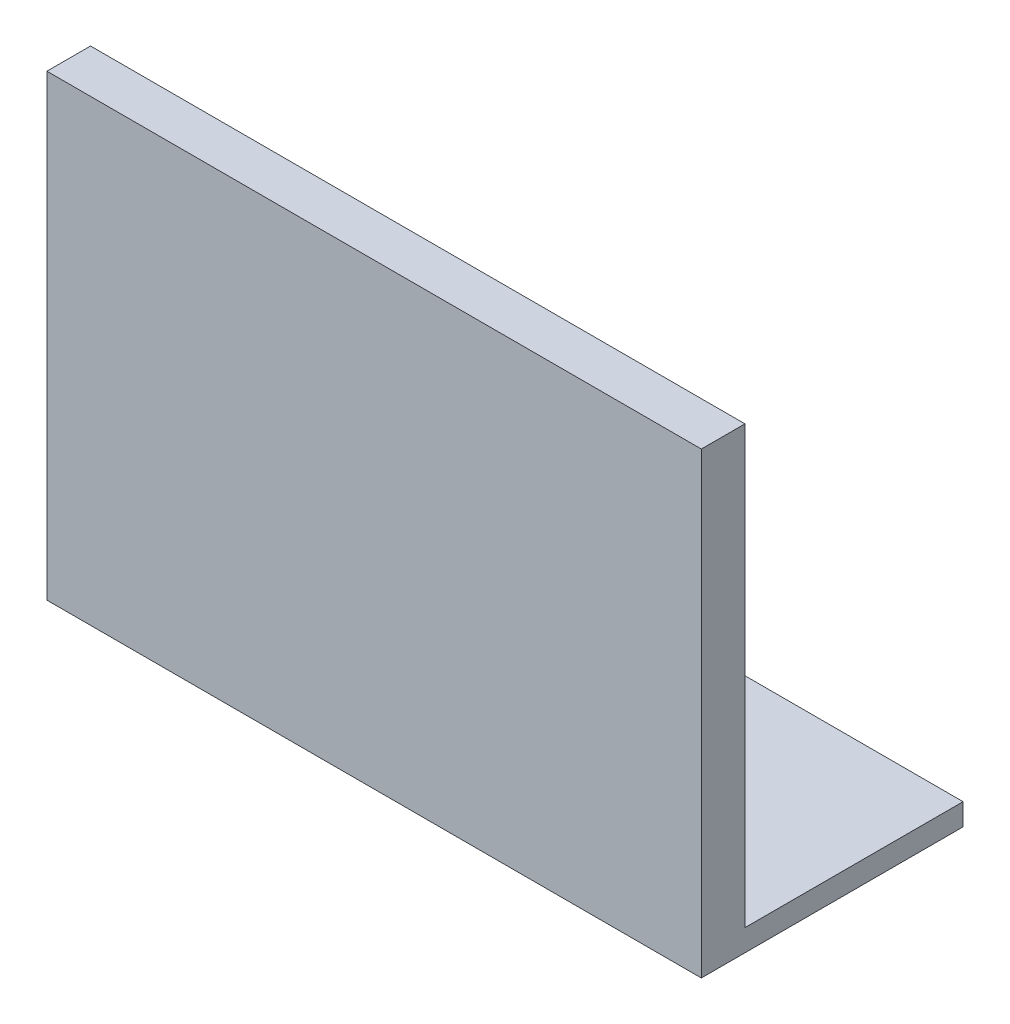
ISO-10303-21;
HEADER;
FILE_DESCRIPTION(('STEP AP214'),'2;1');
FILE_NAME('part.step','',(''),(''),'','','');
FILE_SCHEMA(('AUTOMOTIVE_DESIGN { 1 0 10303 214 1 1 1 1 }'));
ENDSEC;
DATA;
#1=APPLICATION_CONTEXT('core data for automotive mechanical design processes');
#2=APPLICATION_PROTOCOL_DEFINITION('international standard','automotive_design',2000,#1);
#3=PRODUCT_CONTEXT('',#1,'mechanical');
#4=PRODUCT('Part','Part','',(#3));
#5=PRODUCT_RELATED_PRODUCT_CATEGORY('part','',(#4));
#6=PRODUCT_DEFINITION_FORMATION('','',#4);
#7=PRODUCT_DEFINITION_CONTEXT('part definition',#1,'design');
#8=PRODUCT_DEFINITION('design','',#6,#7);
#9=PRODUCT_DEFINITION_SHAPE('','',#8);
#10=(LENGTH_UNIT() NAMED_UNIT(*) SI_UNIT(.MILLI.,.METRE.));
#11=(NAMED_UNIT(*) PLANE_ANGLE_UNIT() SI_UNIT($,.RADIAN.));
#12=(NAMED_UNIT(*) SI_UNIT($,.STERADIAN.) SOLID_ANGLE_UNIT());
#13=UNCERTAINTY_MEASURE_WITH_UNIT(LENGTH_MEASURE(1.E-05),#10,'distance_accuracy_value','');
#14=(GEOMETRIC_REPRESENTATION_CONTEXT(3) GLOBAL_UNCERTAINTY_ASSIGNED_CONTEXT((#13)) GLOBAL_UNIT_ASSIGNED_CONTEXT((#10,
#11,#12)) REPRESENTATION_CONTEXT('',''));
#15=CARTESIAN_POINT('',(0.,0.,0.));
#16=DIRECTION('',(0.,0.,1.));
#17=DIRECTION('',(1.,0.,0.));
#18=AXIS2_PLACEMENT_3D('',#15,#16,#17);
#19=CARTESIAN_POINT('',(25.,0.,-15.));
#20=DIRECTION('',(0.,1.,0.));
#21=DIRECTION('',(0.,0.,1.));
#22=AXIS2_PLACEMENT_3D('',#19,#20,#21);
#23=CYLINDRICAL_SURFACE('',#22,3.5);
#24=CARTESIAN_POINT('',(25.,0.,-15.));
#25=DIRECTION('',(0.,1.,0.));
#26=DIRECTION('',(0.,0.,1.));
#27=AXIS2_PLACEMENT_3D('',#24,#25,#26);
#28=CIRCLE('',#27,3.5);
#29=CARTESIAN_POINT('',(25.,0.,-11.5));
#30=VERTEX_POINT('',#29);
#31=EDGE_CURVE('E132',#30,#30,#28,.T.);
#32=ORIENTED_EDGE('',*,*,#31,.F.);
#33=EDGE_LOOP('',(#32));
#34=FACE_BOUND('',#33,.T.);
#35=CARTESIAN_POINT('',(25.,4.,-15.));
#36=DIRECTION('',(0.,1.,0.));
#37=DIRECTION('',(0.,0.,1.));
#38=AXIS2_PLACEMENT_3D('',#35,#36,#37);
#39=CIRCLE('',#38,3.5);
#40=CARTESIAN_POINT('',(25.,4.,-11.5));
#41=VERTEX_POINT('',#40);
#42=EDGE_CURVE('E43',#41,#41,#39,.F.);
#43=ORIENTED_EDGE('',*,*,#42,.F.);
#44=EDGE_LOOP('',(#43));
#45=FACE_BOUND('',#44,.T.);
#46=ADVANCED_FACE('F39',(#34,#45),#23,.F.);
#47=CARTESIAN_POINT('',(-25.,0.,-15.));
#48=DIRECTION('',(0.,1.,0.));
#49=DIRECTION('',(0.,0.,1.));
#50=AXIS2_PLACEMENT_3D('',#47,#48,#49);
#51=CYLINDRICAL_SURFACE('',#50,3.5);
#52=CARTESIAN_POINT('',(-25.,0.,-15.));
#53=DIRECTION('',(0.,1.,0.));
#54=DIRECTION('',(0.,0.,1.));
#55=AXIS2_PLACEMENT_3D('',#52,#53,#54);
#56=CIRCLE('',#55,3.5);
#57=CARTESIAN_POINT('',(-25.,0.,-11.5));
#58=VERTEX_POINT('',#57);
#59=EDGE_CURVE('E150',#58,#58,#56,.T.);
#60=ORIENTED_EDGE('',*,*,#59,.F.);
#61=EDGE_LOOP('',(#60));
#62=FACE_BOUND('',#61,.T.);
#63=CARTESIAN_POINT('',(-25.,4.,-15.));
#64=DIRECTION('',(0.,1.,0.));
#65=DIRECTION('',(0.,0.,1.));
#66=AXIS2_PLACEMENT_3D('',#63,#64,#65);
#67=CIRCLE('',#66,3.5);
#68=CARTESIAN_POINT('',(-25.,4.,-11.5));
#69=VERTEX_POINT('',#68);
#70=EDGE_CURVE('E123',#69,#69,#67,.F.);
#71=ORIENTED_EDGE('',*,*,#70,.F.);
#72=EDGE_LOOP('',(#71));
#73=FACE_BOUND('',#72,.T.);
#74=ADVANCED_FACE('F217',(#62,#73),#51,.F.);
#75=CARTESIAN_POINT('',(0.,5.,0.));
#76=DIRECTION('',(0.,-1.,0.));
#77=DIRECTION('',(0.,0.,-1.));
#78=AXIS2_PLACEMENT_3D('',#75,#76,#77);
#79=PLANE('',#78);
#80=CARTESIAN_POINT('',(-25.,5.,-15.));
#81=DIRECTION('',(0.,1.,0.));
#82=DIRECTION('',(0.,0.,1.));
#83=AXIS2_PLACEMENT_3D('',#80,#81,#82);
#84=CIRCLE('',#83,5.);
#85=CARTESIAN_POINT('',(-25.,5.,-9.99999999999999));
#86=VERTEX_POINT('',#85);
#87=EDGE_CURVE('E134',#86,#86,#84,.T.);
#88=ORIENTED_EDGE('',*,*,#87,.F.);
#89=EDGE_LOOP('',(#88));
#90=FACE_BOUND('',#89,.T.);
#91=CARTESIAN_POINT('',(25.,5.,-15.));
#92=DIRECTION('',(0.,1.,0.));
#93=DIRECTION('',(0.,0.,1.));
#94=AXIS2_PLACEMENT_3D('',#91,#92,#93);
#95=CIRCLE('',#94,5.);
#96=CARTESIAN_POINT('',(25.,5.,-10.));
#97=VERTEX_POINT('',#96);
#98=EDGE_CURVE('E146',#97,#97,#95,.T.);
#99=ORIENTED_EDGE('',*,*,#98,.F.);
#100=EDGE_LOOP('',(#99));
#101=FACE_BOUND('',#100,.T.);
#102=DIRECTION('',(-1.,0.,0.));
#103=VECTOR('',#102,1.);
#104=CARTESIAN_POINT('',(-75.,5.,20.));
#105=LINE('',#104,#103);
#106=CARTESIAN_POINT('',(75.,5.,20.));
#107=VERTEX_POINT('',#106);
#108=CARTESIAN_POINT('',(-75.,5.,20.));
#109=VERTEX_POINT('',#108);
#110=EDGE_CURVE('E57',#107,#109,#105,.T.);
#111=ORIENTED_EDGE('',*,*,#110,.F.);
#112=DIRECTION('',(0.,0.,-1.));
#113=VECTOR('',#112,1.);
#114=CARTESIAN_POINT('',(75.,5.,-30.));
#115=LINE('',#114,#113);
#116=CARTESIAN_POINT('',(75.,5.,-30.));
#117=VERTEX_POINT('',#116);
#118=EDGE_CURVE('E178',#107,#117,#115,.T.);
#119=ORIENTED_EDGE('',*,*,#118,.T.);
#120=DIRECTION('',(-1.,0.,0.));
#121=VECTOR('',#120,1.);
#122=CARTESIAN_POINT('',(75.,5.,-30.));
#123=LINE('',#122,#121);
#124=CARTESIAN_POINT('',(-75.,5.,-30.));
#125=VERTEX_POINT('',#124);
#126=EDGE_CURVE('E63',#117,#125,#123,.T.);
#127=ORIENTED_EDGE('',*,*,#126,.T.);
#128=DIRECTION('',(0.,0.,1.));
#129=VECTOR('',#128,1.);
#130=CARTESIAN_POINT('',(-75.,5.,-30.));
#131=LINE('',#130,#129);
#132=EDGE_CURVE('E93',#125,#109,#131,.T.);
#133=ORIENTED_EDGE('',*,*,#132,.T.);
#134=EDGE_LOOP('',(#111,#119,#127,#133));
#135=FACE_BOUND('',#134,.T.);
#136=ADVANCED_FACE('F181',(#90,#101,#135),#79,.F.);
#137=CARTESIAN_POINT('',(-75.,5.,-30.));
#138=DIRECTION('',(1.,0.,0.));
#139=DIRECTION('',(0.,0.,-1.));
#140=AXIS2_PLACEMENT_3D('',#137,#138,#139);
#141=PLANE('',#140);
#142=DIRECTION('',(0.,0.,1.));
#143=VECTOR('',#142,1.);
#144=CARTESIAN_POINT('',(-75.,0.,-30.));
#145=LINE('',#144,#143);
#146=CARTESIAN_POINT('',(-75.,0.,-30.));
#147=VERTEX_POINT('',#146);
#148=CARTESIAN_POINT('',(-75.,0.,30.));
#149=VERTEX_POINT('',#148);
#150=EDGE_CURVE('E99',#147,#149,#145,.T.);
#151=ORIENTED_EDGE('',*,*,#150,.T.);
#152=DIRECTION('',(0.,-1.,0.));
#153=VECTOR('',#152,1.);
#154=CARTESIAN_POINT('',(-75.,5.,30.));
#155=LINE('',#154,#153);
#156=CARTESIAN_POINT('',(-75.,105.,30.));
#157=VERTEX_POINT('',#156);
#158=EDGE_CURVE('E11',#157,#149,#155,.T.);
#159=ORIENTED_EDGE('',*,*,#158,.F.);
#160=DIRECTION('',(0.,0.,1.));
#161=VECTOR('',#160,1.);
#162=CARTESIAN_POINT('',(-75.,105.,30.));
#163=LINE('',#162,#161);
#164=CARTESIAN_POINT('',(-75.,105.,20.));
#165=VERTEX_POINT('',#164);
#166=EDGE_CURVE('E157',#165,#157,#163,.T.);
#167=ORIENTED_EDGE('',*,*,#166,.F.);
#168=DIRECTION('',(0.,-1.,0.));
#169=VECTOR('',#168,1.);
#170=CARTESIAN_POINT('',(-75.,105.,20.));
#171=LINE('',#170,#169);
#172=EDGE_CURVE('E112',#165,#109,#171,.T.);
#173=ORIENTED_EDGE('',*,*,#172,.T.);
#174=ORIENTED_EDGE('',*,*,#132,.F.);
#175=DIRECTION('',(0.,-1.,0.));
#176=VECTOR('',#175,1.);
#177=CARTESIAN_POINT('',(-75.,5.,-30.));
#178=LINE('',#177,#176);
#179=EDGE_CURVE('E85',#125,#147,#178,.T.);
#180=ORIENTED_EDGE('',*,*,#179,.T.);
#181=EDGE_LOOP('',(#151,#159,#167,#173,#174,#180));
#182=FACE_BOUND('',#181,.T.);
#183=ADVANCED_FACE('F41',(#182),#141,.F.);
#184=CARTESIAN_POINT('',(75.,5.,30.));
#185=DIRECTION('',(0.,0.,-1.));
#186=DIRECTION('',(-1.,0.,0.));
#187=AXIS2_PLACEMENT_3D('',#184,#185,#186);
#188=PLANE('',#187);
#189=DIRECTION('',(1.,0.,0.));
#190=VECTOR('',#189,1.);
#191=CARTESIAN_POINT('',(75.,0.,30.));
#192=LINE('',#191,#190);
#193=CARTESIAN_POINT('',(75.,0.,30.));
#194=VERTEX_POINT('',#193);
#195=EDGE_CURVE('E104',#149,#194,#192,.T.);
#196=ORIENTED_EDGE('',*,*,#195,.T.);
#197=DIRECTION('',(0.,-1.,0.));
#198=VECTOR('',#197,1.);
#199=CARTESIAN_POINT('',(75.,5.,30.));
#200=LINE('',#199,#198);
#201=CARTESIAN_POINT('',(75.,105.,30.));
#202=VERTEX_POINT('',#201);
#203=EDGE_CURVE('E49',#202,#194,#200,.T.);
#204=ORIENTED_EDGE('',*,*,#203,.F.);
#205=DIRECTION('',(1.,0.,0.));
#206=VECTOR('',#205,1.);
#207=CARTESIAN_POINT('',(-75.,105.,30.));
#208=LINE('',#207,#206);
#209=EDGE_CURVE('E161',#157,#202,#208,.T.);
#210=ORIENTED_EDGE('',*,*,#209,.F.);
#211=ORIENTED_EDGE('',*,*,#158,.T.);
#212=EDGE_LOOP('',(#196,#204,#210,#211));
#213=FACE_BOUND('',#212,.T.);
#214=ADVANCED_FACE('F190',(#213),#188,.F.);
#215=CARTESIAN_POINT('',(75.,5.,-30.));
#216=DIRECTION('',(-1.,0.,0.));
#217=DIRECTION('',(0.,0.,1.));
#218=AXIS2_PLACEMENT_3D('',#215,#216,#217);
#219=PLANE('',#218);
#220=DIRECTION('',(0.,0.,-1.));
#221=VECTOR('',#220,1.);
#222=CARTESIAN_POINT('',(75.,0.,-30.));
#223=LINE('',#222,#221);
#224=CARTESIAN_POINT('',(75.,0.,-30.));
#225=VERTEX_POINT('',#224);
#226=EDGE_CURVE('E94',#194,#225,#223,.T.);
#227=ORIENTED_EDGE('',*,*,#226,.T.);
#228=DIRECTION('',(0.,-1.,0.));
#229=VECTOR('',#228,1.);
#230=CARTESIAN_POINT('',(75.,5.,-30.));
#231=LINE('',#230,#229);
#232=EDGE_CURVE('E88',#117,#225,#231,.T.);
#233=ORIENTED_EDGE('',*,*,#232,.F.);
#234=ORIENTED_EDGE('',*,*,#118,.F.);
#235=DIRECTION('',(0.,-1.,0.));
#236=VECTOR('',#235,1.);
#237=CARTESIAN_POINT('',(75.,105.,20.));
#238=LINE('',#237,#236);
#239=CARTESIAN_POINT('',(75.,105.,20.));
#240=VERTEX_POINT('',#239);
#241=EDGE_CURVE('E106',#240,#107,#238,.T.);
#242=ORIENTED_EDGE('',*,*,#241,.F.);
#243=DIRECTION('',(0.,0.,-1.));
#244=VECTOR('',#243,1.);
#245=CARTESIAN_POINT('',(75.,105.,30.));
#246=LINE('',#245,#244);
#247=EDGE_CURVE('E165',#202,#240,#246,.T.);
#248=ORIENTED_EDGE('',*,*,#247,.F.);
#249=ORIENTED_EDGE('',*,*,#203,.T.);
#250=EDGE_LOOP('',(#227,#233,#234,#242,#248,#249));
#251=FACE_BOUND('',#250,.T.);
#252=ADVANCED_FACE('F184',(#251),#219,.F.);
#253=CARTESIAN_POINT('',(75.,5.,-30.));
#254=DIRECTION('',(0.,0.,1.));
#255=DIRECTION('',(1.,0.,0.));
#256=AXIS2_PLACEMENT_3D('',#253,#254,#255);
#257=PLANE('',#256);
#258=DIRECTION('',(-1.,0.,0.));
#259=VECTOR('',#258,1.);
#260=CARTESIAN_POINT('',(75.,0.,-30.));
#261=LINE('',#260,#259);
#262=EDGE_CURVE('E82',#225,#147,#261,.T.);
#263=ORIENTED_EDGE('',*,*,#262,.T.);
#264=ORIENTED_EDGE('',*,*,#179,.F.);
#265=ORIENTED_EDGE('',*,*,#126,.F.);
#266=ORIENTED_EDGE('',*,*,#232,.T.);
#267=EDGE_LOOP('',(#263,#264,#265,#266));
#268=FACE_BOUND('',#267,.T.);
#269=ADVANCED_FACE('F84',(#268),#257,.F.);
#270=CARTESIAN_POINT('',(0.,0.,0.));
#271=DIRECTION('',(0.,-1.,0.));
#272=DIRECTION('',(0.,0.,-1.));
#273=AXIS2_PLACEMENT_3D('',#270,#271,#272);
#274=PLANE('',#273);
#275=ORIENTED_EDGE('',*,*,#59,.T.);
#276=EDGE_LOOP('',(#275));
#277=FACE_BOUND('',#276,.T.);
#278=ORIENTED_EDGE('',*,*,#31,.T.);
#279=EDGE_LOOP('',(#278));
#280=FACE_BOUND('',#279,.T.);
#281=ORIENTED_EDGE('',*,*,#150,.F.);
#282=ORIENTED_EDGE('',*,*,#262,.F.);
#283=ORIENTED_EDGE('',*,*,#226,.F.);
#284=ORIENTED_EDGE('',*,*,#195,.F.);
#285=EDGE_LOOP('',(#281,#282,#283,#284));
#286=FACE_BOUND('',#285,.T.);
#287=ADVANCED_FACE('F103',(#277,#280,#286),#274,.T.);
#288=CARTESIAN_POINT('',(-75.,105.,20.));
#289=DIRECTION('',(0.,0.,1.));
#290=DIRECTION('',(1.,0.,0.));
#291=AXIS2_PLACEMENT_3D('',#288,#289,#290);
#292=PLANE('',#291);
#293=ORIENTED_EDGE('',*,*,#110,.T.);
#294=ORIENTED_EDGE('',*,*,#172,.F.);
#295=DIRECTION('',(-1.,0.,0.));
#296=VECTOR('',#295,1.);
#297=CARTESIAN_POINT('',(-75.,105.,20.));
#298=LINE('',#297,#296);
#299=EDGE_CURVE('E169',#240,#165,#298,.T.);
#300=ORIENTED_EDGE('',*,*,#299,.F.);
#301=ORIENTED_EDGE('',*,*,#241,.T.);
#302=EDGE_LOOP('',(#293,#294,#300,#301));
#303=FACE_BOUND('',#302,.T.);
#304=ADVANCED_FACE('F204',(#303),#292,.F.);
#305=CARTESIAN_POINT('',(0.,105.,0.));
#306=DIRECTION('',(0.,-1.,0.));
#307=DIRECTION('',(0.,0.,-1.));
#308=AXIS2_PLACEMENT_3D('',#305,#306,#307);
#309=PLANE('',#308);
#310=ORIENTED_EDGE('',*,*,#166,.T.);
#311=ORIENTED_EDGE('',*,*,#209,.T.);
#312=ORIENTED_EDGE('',*,*,#247,.T.);
#313=ORIENTED_EDGE('',*,*,#299,.T.);
#314=EDGE_LOOP('',(#310,#311,#312,#313));
#315=FACE_BOUND('',#314,.T.);
#316=ADVANCED_FACE('F195',(#315),#309,.F.);
#317=CARTESIAN_POINT('',(-25.,4.,-15.));
#318=DIRECTION('',(0.,1.,0.));
#319=DIRECTION('',(0.,0.,1.));
#320=AXIS2_PLACEMENT_3D('',#317,#318,#319);
#321=PLANE('',#320);
#322=CARTESIAN_POINT('',(-25.,4.,-15.));
#323=DIRECTION('',(0.,1.,0.));
#324=DIRECTION('',(0.,0.,1.));
#325=AXIS2_PLACEMENT_3D('',#322,#323,#324);
#326=CIRCLE('',#325,5.);
#327=CARTESIAN_POINT('',(-25.,4.,-9.99999999999999));
#328=VERTEX_POINT('',#327);
#329=EDGE_CURVE('E126',#328,#328,#326,.T.);
#330=ORIENTED_EDGE('',*,*,#329,.T.);
#331=EDGE_LOOP('',(#330));
#332=FACE_BOUND('',#331,.T.);
#333=ORIENTED_EDGE('',*,*,#70,.T.);
#334=EDGE_LOOP('',(#333));
#335=FACE_BOUND('',#334,.T.);
#336=ADVANCED_FACE('F211',(#332,#335),#321,.T.);
#337=CARTESIAN_POINT('',(-25.,4.,-15.));
#338=DIRECTION('',(0.,1.,0.));
#339=DIRECTION('',(0.,0.,1.));
#340=AXIS2_PLACEMENT_3D('',#337,#338,#339);
#341=CYLINDRICAL_SURFACE('',#340,5.);
#342=ORIENTED_EDGE('',*,*,#329,.F.);
#343=EDGE_LOOP('',(#342));
#344=FACE_BOUND('',#343,.T.);
#345=ORIENTED_EDGE('',*,*,#87,.T.);
#346=EDGE_LOOP('',(#345));
#347=FACE_BOUND('',#346,.T.);
#348=ADVANCED_FACE('F235',(#344,#347),#341,.F.);
#349=CARTESIAN_POINT('',(25.,4.,-15.));
#350=DIRECTION('',(0.,1.,0.));
#351=DIRECTION('',(0.,0.,1.));
#352=AXIS2_PLACEMENT_3D('',#349,#350,#351);
#353=PLANE('',#352);
#354=CARTESIAN_POINT('',(25.,4.,-15.));
#355=DIRECTION('',(0.,1.,0.));
#356=DIRECTION('',(0.,0.,1.));
#357=AXIS2_PLACEMENT_3D('',#354,#355,#356);
#358=CIRCLE('',#357,5.);
#359=CARTESIAN_POINT('',(25.,4.,-10.));
#360=VERTEX_POINT('',#359);
#361=EDGE_CURVE('E140',#360,#360,#358,.T.);
#362=ORIENTED_EDGE('',*,*,#361,.T.);
#363=EDGE_LOOP('',(#362));
#364=FACE_BOUND('',#363,.T.);
#365=ORIENTED_EDGE('',*,*,#42,.T.);
#366=EDGE_LOOP('',(#365));
#367=FACE_BOUND('',#366,.T.);
#368=ADVANCED_FACE('F231',(#364,#367),#353,.T.);
#369=CARTESIAN_POINT('',(25.,4.,-15.));
#370=DIRECTION('',(0.,1.,0.));
#371=DIRECTION('',(0.,0.,1.));
#372=AXIS2_PLACEMENT_3D('',#369,#370,#371);
#373=CYLINDRICAL_SURFACE('',#372,5.);
#374=ORIENTED_EDGE('',*,*,#361,.F.);
#375=EDGE_LOOP('',(#374));
#376=FACE_BOUND('',#375,.T.);
#377=ORIENTED_EDGE('',*,*,#98,.T.);
#378=EDGE_LOOP('',(#377));
#379=FACE_BOUND('',#378,.T.);
#380=ADVANCED_FACE('F228',(#376,#379),#373,.F.);
#381=CLOSED_SHELL('',(#46,#74,#136,#183,#214,#252,#269,#287,#304,#316,#336,#348,#368,#380));
#382=MANIFOLD_SOLID_BREP('B2',#381);
#383=ADVANCED_BREP_SHAPE_REPRESENTATION('',(#18,#382),#14);
#384=SHAPE_DEFINITION_REPRESENTATION(#9,#383);
ENDSEC;
END-ISO-10303-21;
